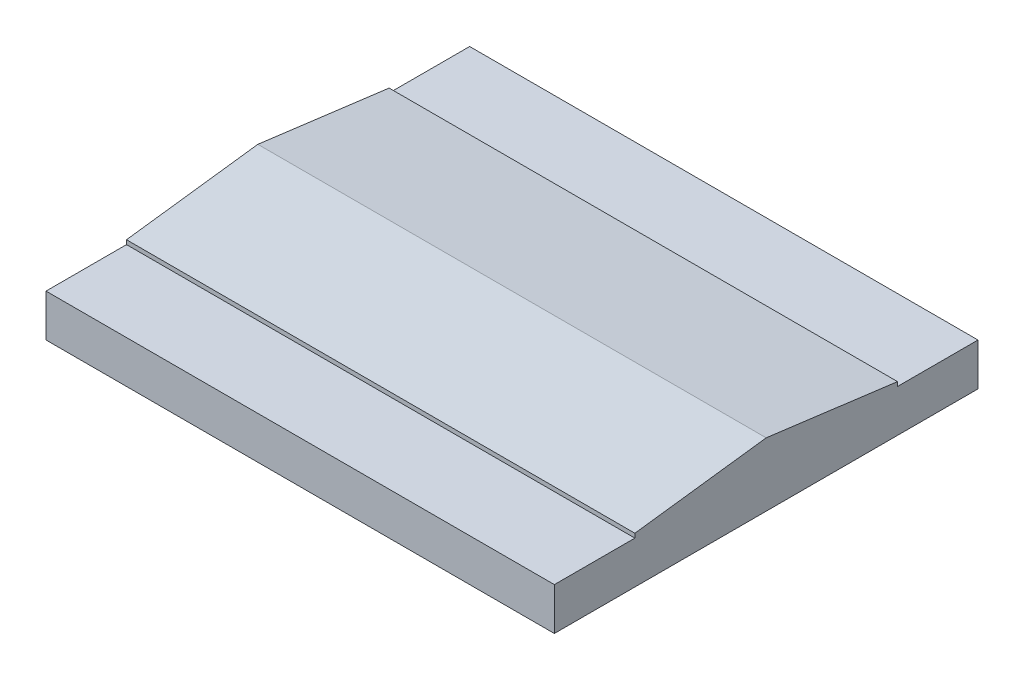
ISO-10303-21;
HEADER;
FILE_DESCRIPTION(('STEP AP214'),'2;1');
FILE_NAME('part.step','',(''),(''),'','','');
FILE_SCHEMA(('AUTOMOTIVE_DESIGN { 1 0 10303 214 1 1 1 1 }'));
ENDSEC;
DATA;
#1=APPLICATION_CONTEXT('core data for automotive mechanical design processes');
#2=APPLICATION_PROTOCOL_DEFINITION('international standard','automotive_design',2000,#1);
#3=PRODUCT_CONTEXT('',#1,'mechanical');
#4=PRODUCT('Part','Part','',(#3));
#5=PRODUCT_RELATED_PRODUCT_CATEGORY('part','',(#4));
#6=PRODUCT_DEFINITION_FORMATION('','',#4);
#7=PRODUCT_DEFINITION_CONTEXT('part definition',#1,'design');
#8=PRODUCT_DEFINITION('design','',#6,#7);
#9=PRODUCT_DEFINITION_SHAPE('','',#8);
#10=(LENGTH_UNIT() NAMED_UNIT(*) SI_UNIT(.MILLI.,.METRE.));
#11=(NAMED_UNIT(*) PLANE_ANGLE_UNIT() SI_UNIT($,.RADIAN.));
#12=(NAMED_UNIT(*) SI_UNIT($,.STERADIAN.) SOLID_ANGLE_UNIT());
#13=UNCERTAINTY_MEASURE_WITH_UNIT(LENGTH_MEASURE(1.E-05),#10,'distance_accuracy_value','');
#14=(GEOMETRIC_REPRESENTATION_CONTEXT(3) GLOBAL_UNCERTAINTY_ASSIGNED_CONTEXT((#13)) GLOBAL_UNIT_ASSIGNED_CONTEXT((#10,
#11,#12)) REPRESENTATION_CONTEXT('',''));
#15=CARTESIAN_POINT('',(0.,0.,0.));
#16=DIRECTION('',(0.,0.,1.));
#17=DIRECTION('',(1.,0.,0.));
#18=AXIS2_PLACEMENT_3D('',#15,#16,#17);
#19=CARTESIAN_POINT('',(-1.11022302462516E-13,75.,-500.));
#20=DIRECTION('',(1.,0.,0.));
#21=DIRECTION('',(0.,0.,-1.));
#22=AXIS2_PLACEMENT_3D('',#19,#20,#21);
#23=PLANE('',#22);
#24=DIRECTION('',(0.,1.,0.));
#25=VECTOR('',#24,1.);
#26=CARTESIAN_POINT('',(-2.22044604925031E-13,50.0000000000001,-94.9999999999999));
#27=LINE('',#26,#25);
#28=CARTESIAN_POINT('',(-2.22044604925031E-13,50.0000000000001,-94.9999999999999));
#29=VERTEX_POINT('',#28);
#30=CARTESIAN_POINT('',(-2.22044604925031E-13,55.0000000000001,-94.9999999999999));
#31=VERTEX_POINT('',#30);
#32=EDGE_CURVE('E125',#29,#31,#27,.T.);
#33=ORIENTED_EDGE('',*,*,#32,.T.);
#34=DIRECTION('',(0.,0.127971337630196,-0.991777866634025));
#35=VECTOR('',#34,1.);
#36=CARTESIAN_POINT('',(-2.22044604925031E-13,55.0000000000001,-94.9999999999999));
#37=LINE('',#36,#35);
#38=CARTESIAN_POINT('',(-2.22044604925031E-13,75.,-250.));
#39=VERTEX_POINT('',#38);
#40=EDGE_CURVE('E109',#31,#39,#37,.T.);
#41=ORIENTED_EDGE('',*,*,#40,.T.);
#42=DIRECTION('',(0.,-0.127971337630196,-0.991777866634025));
#43=VECTOR('',#42,1.);
#44=CARTESIAN_POINT('',(-1.11022302462516E-13,75.,-250.));
#45=LINE('',#44,#43);
#46=CARTESIAN_POINT('',(-2.22044604925031E-13,55.0000000000001,-405.));
#47=VERTEX_POINT('',#46);
#48=EDGE_CURVE('E122',#39,#47,#45,.T.);
#49=ORIENTED_EDGE('',*,*,#48,.T.);
#50=DIRECTION('',(0.,-1.,0.));
#51=VECTOR('',#50,1.);
#52=CARTESIAN_POINT('',(-2.22044604925031E-13,55.0000000000001,-405.));
#53=LINE('',#52,#51);
#54=CARTESIAN_POINT('',(-2.22044604925031E-13,50.0000000000001,-405.));
#55=VERTEX_POINT('',#54);
#56=EDGE_CURVE('E132',#47,#55,#53,.T.);
#57=ORIENTED_EDGE('',*,*,#56,.T.);
#58=DIRECTION('',(0.,0.,-1.));
#59=VECTOR('',#58,1.);
#60=CARTESIAN_POINT('',(-2.22044604925031E-13,50.0000000000001,-405.));
#61=LINE('',#60,#59);
#62=CARTESIAN_POINT('',(-2.22044604925031E-13,49.9999999999999,-500.));
#63=VERTEX_POINT('',#62);
#64=EDGE_CURVE('E135',#55,#63,#61,.T.);
#65=ORIENTED_EDGE('',*,*,#64,.T.);
#66=DIRECTION('',(0.,-1.,0.));
#67=VECTOR('',#66,1.);
#68=CARTESIAN_POINT('',(-1.11022302462516E-13,75.,-500.));
#69=LINE('',#68,#67);
#70=CARTESIAN_POINT('',(-1.11022302462516E-13,0.,-500.));
#71=VERTEX_POINT('',#70);
#72=EDGE_CURVE('E48',#63,#71,#69,.T.);
#73=ORIENTED_EDGE('',*,*,#72,.T.);
#74=DIRECTION('',(0.,0.,1.));
#75=VECTOR('',#74,1.);
#76=CARTESIAN_POINT('',(-1.11022302462516E-13,0.,-500.));
#77=LINE('',#76,#75);
#78=CARTESIAN_POINT('',(0.,0.,0.));
#79=VERTEX_POINT('',#78);
#80=EDGE_CURVE('E117',#71,#79,#77,.T.);
#81=ORIENTED_EDGE('',*,*,#80,.T.);
#82=DIRECTION('',(0.,-1.,0.));
#83=VECTOR('',#82,1.);
#84=CARTESIAN_POINT('',(0.,75.,0.));
#85=LINE('',#84,#83);
#86=CARTESIAN_POINT('',(-2.22044604925031E-13,50.0000000000001,1.33226762955019E-13));
#87=VERTEX_POINT('',#86);
#88=EDGE_CURVE('E11',#87,#79,#85,.T.);
#89=ORIENTED_EDGE('',*,*,#88,.F.);
#90=DIRECTION('',(0.,0.,-1.));
#91=VECTOR('',#90,1.);
#92=CARTESIAN_POINT('',(-2.22044604925031E-13,50.0000000000001,1.33226762955019E-13));
#93=LINE('',#92,#91);
#94=EDGE_CURVE('E126',#87,#29,#93,.T.);
#95=ORIENTED_EDGE('',*,*,#94,.T.);
#96=EDGE_LOOP('',(#33,#41,#49,#57,#65,#73,#81,#89,#95));
#97=FACE_BOUND('',#96,.T.);
#98=ADVANCED_FACE('F34',(#97),#23,.F.);
#99=CARTESIAN_POINT('',(0.,75.,0.));
#100=DIRECTION('',(0.,0.,-1.));
#101=DIRECTION('',(-1.,0.,0.));
#102=AXIS2_PLACEMENT_3D('',#99,#100,#101);
#103=PLANE('',#102);
#104=DIRECTION('',(0.,-1.,0.));
#105=VECTOR('',#104,1.);
#106=CARTESIAN_POINT('',(600.,75.,0.));
#107=LINE('',#106,#105);
#108=CARTESIAN_POINT('',(600.,50.0000000000001,0.));
#109=VERTEX_POINT('',#108);
#110=CARTESIAN_POINT('',(600.,0.,0.));
#111=VERTEX_POINT('',#110);
#112=EDGE_CURVE('E41',#109,#111,#107,.T.);
#113=ORIENTED_EDGE('',*,*,#112,.F.);
#114=DIRECTION('',(1.,0.,0.));
#115=VECTOR('',#114,1.);
#116=CARTESIAN_POINT('',(-2.22044604925031E-13,50.0000000000001,1.33226762955019E-13));
#117=LINE('',#116,#115);
#118=EDGE_CURVE('E140',#87,#109,#117,.T.);
#119=ORIENTED_EDGE('',*,*,#118,.F.);
#120=ORIENTED_EDGE('',*,*,#88,.T.);
#121=DIRECTION('',(1.,0.,0.));
#122=VECTOR('',#121,1.);
#123=CARTESIAN_POINT('',(0.,0.,0.));
#124=LINE('',#123,#122);
#125=EDGE_CURVE('E154',#79,#111,#124,.T.);
#126=ORIENTED_EDGE('',*,*,#125,.T.);
#127=EDGE_LOOP('',(#113,#119,#120,#126));
#128=FACE_BOUND('',#127,.T.);
#129=ADVANCED_FACE('F174',(#128),#103,.F.);
#130=CARTESIAN_POINT('',(600.,75.,-500.));
#131=DIRECTION('',(-1.,0.,0.));
#132=DIRECTION('',(0.,0.,1.));
#133=AXIS2_PLACEMENT_3D('',#130,#131,#132);
#134=PLANE('',#133);
#135=DIRECTION('',(0.,-0.127971337630196,-0.991777866634025));
#136=VECTOR('',#135,1.);
#137=CARTESIAN_POINT('',(600.,75.,-250.));
#138=LINE('',#137,#136);
#139=CARTESIAN_POINT('',(600.,75.,-250.));
#140=VERTEX_POINT('',#139);
#141=CARTESIAN_POINT('',(600.,55.0000000000001,-405.));
#142=VERTEX_POINT('',#141);
#143=EDGE_CURVE('E144',#140,#142,#138,.T.);
#144=ORIENTED_EDGE('',*,*,#143,.F.);
#145=DIRECTION('',(0.,0.127971337630196,-0.991777866634025));
#146=VECTOR('',#145,1.);
#147=CARTESIAN_POINT('',(600.,55.0000000000001,-95.));
#148=LINE('',#147,#146);
#149=CARTESIAN_POINT('',(600.,55.0000000000001,-95.));
#150=VERTEX_POINT('',#149);
#151=EDGE_CURVE('E112',#150,#140,#148,.T.);
#152=ORIENTED_EDGE('',*,*,#151,.F.);
#153=DIRECTION('',(0.,1.,0.));
#154=VECTOR('',#153,1.);
#155=CARTESIAN_POINT('',(600.,50.0000000000001,-95.));
#156=LINE('',#155,#154);
#157=CARTESIAN_POINT('',(600.,50.0000000000001,-95.));
#158=VERTEX_POINT('',#157);
#159=EDGE_CURVE('E127',#158,#150,#156,.T.);
#160=ORIENTED_EDGE('',*,*,#159,.F.);
#161=DIRECTION('',(0.,0.,-1.));
#162=VECTOR('',#161,1.);
#163=CARTESIAN_POINT('',(600.,50.0000000000001,0.));
#164=LINE('',#163,#162);
#165=EDGE_CURVE('E170',#109,#158,#164,.T.);
#166=ORIENTED_EDGE('',*,*,#165,.F.);
#167=ORIENTED_EDGE('',*,*,#112,.T.);
#168=DIRECTION('',(0.,0.,-1.));
#169=VECTOR('',#168,1.);
#170=CARTESIAN_POINT('',(600.,0.,-500.));
#171=LINE('',#170,#169);
#172=CARTESIAN_POINT('',(600.,0.,-500.));
#173=VERTEX_POINT('',#172);
#174=EDGE_CURVE('E157',#111,#173,#171,.T.);
#175=ORIENTED_EDGE('',*,*,#174,.T.);
#176=DIRECTION('',(0.,-1.,0.));
#177=VECTOR('',#176,1.);
#178=CARTESIAN_POINT('',(600.,75.,-500.));
#179=LINE('',#178,#177);
#180=CARTESIAN_POINT('',(600.,49.9999999999999,-500.));
#181=VERTEX_POINT('',#180);
#182=EDGE_CURVE('E55',#181,#173,#179,.T.);
#183=ORIENTED_EDGE('',*,*,#182,.F.);
#184=DIRECTION('',(0.,0.,-1.));
#185=VECTOR('',#184,1.);
#186=CARTESIAN_POINT('',(600.,50.0000000000001,-405.));
#187=LINE('',#186,#185);
#188=CARTESIAN_POINT('',(600.,50.0000000000001,-405.));
#189=VERTEX_POINT('',#188);
#190=EDGE_CURVE('E133',#189,#181,#187,.T.);
#191=ORIENTED_EDGE('',*,*,#190,.F.);
#192=DIRECTION('',(0.,-1.,0.));
#193=VECTOR('',#192,1.);
#194=CARTESIAN_POINT('',(600.,55.0000000000001,-405.));
#195=LINE('',#194,#193);
#196=EDGE_CURVE('E137',#142,#189,#195,.T.);
#197=ORIENTED_EDGE('',*,*,#196,.F.);
#198=EDGE_LOOP('',(#144,#152,#160,#166,#167,#175,#183,#191,#197));
#199=FACE_BOUND('',#198,.T.);
#200=ADVANCED_FACE('F165',(#199),#134,.F.);
#201=CARTESIAN_POINT('',(-1.11022302462516E-13,75.,-500.));
#202=DIRECTION('',(0.,0.,1.));
#203=DIRECTION('',(1.,0.,0.));
#204=AXIS2_PLACEMENT_3D('',#201,#202,#203);
#205=PLANE('',#204);
#206=ORIENTED_EDGE('',*,*,#72,.F.);
#207=DIRECTION('',(1.,0.,0.));
#208=VECTOR('',#207,1.);
#209=CARTESIAN_POINT('',(-2.22044604925031E-13,49.9999999999999,-500.));
#210=LINE('',#209,#208);
#211=EDGE_CURVE('E118',#63,#181,#210,.T.);
#212=ORIENTED_EDGE('',*,*,#211,.T.);
#213=ORIENTED_EDGE('',*,*,#182,.T.);
#214=DIRECTION('',(-1.,0.,0.));
#215=VECTOR('',#214,1.);
#216=CARTESIAN_POINT('',(-1.11022302462516E-13,0.,-500.));
#217=LINE('',#216,#215);
#218=EDGE_CURVE('E159',#173,#71,#217,.T.);
#219=ORIENTED_EDGE('',*,*,#218,.T.);
#220=EDGE_LOOP('',(#206,#212,#213,#219));
#221=FACE_BOUND('',#220,.T.);
#222=ADVANCED_FACE('F179',(#221),#205,.F.);
#223=CARTESIAN_POINT('',(0.,0.,0.));
#224=DIRECTION('',(0.,1.,0.));
#225=DIRECTION('',(0.,0.,1.));
#226=AXIS2_PLACEMENT_3D('',#223,#224,#225);
#227=PLANE('',#226);
#228=ORIENTED_EDGE('',*,*,#80,.F.);
#229=ORIENTED_EDGE('',*,*,#218,.F.);
#230=ORIENTED_EDGE('',*,*,#174,.F.);
#231=ORIENTED_EDGE('',*,*,#125,.F.);
#232=EDGE_LOOP('',(#228,#229,#230,#231));
#233=FACE_BOUND('',#232,.T.);
#234=ADVANCED_FACE('F178',(#233),#227,.F.);
#235=CARTESIAN_POINT('',(-1.11022302462516E-13,75.,-250.));
#236=DIRECTION('',(0.,-0.991777866634025,0.127971337630196));
#237=DIRECTION('',(0.,-0.127971337630196,-0.991777866634025));
#238=AXIS2_PLACEMENT_3D('',#235,#236,#237);
#239=PLANE('',#238);
#240=ORIENTED_EDGE('',*,*,#143,.T.);
#241=DIRECTION('',(1.,0.,0.));
#242=VECTOR('',#241,1.);
#243=CARTESIAN_POINT('',(-2.22044604925031E-13,55.0000000000001,-405.));
#244=LINE('',#243,#242);
#245=EDGE_CURVE('E130',#47,#142,#244,.T.);
#246=ORIENTED_EDGE('',*,*,#245,.F.);
#247=ORIENTED_EDGE('',*,*,#48,.F.);
#248=DIRECTION('',(1.,0.,0.));
#249=VECTOR('',#248,1.);
#250=CARTESIAN_POINT('',(-1.11022302462516E-13,75.,-250.));
#251=LINE('',#250,#249);
#252=EDGE_CURVE('E106',#39,#140,#251,.T.);
#253=ORIENTED_EDGE('',*,*,#252,.T.);
#254=EDGE_LOOP('',(#240,#246,#247,#253));
#255=FACE_BOUND('',#254,.T.);
#256=ADVANCED_FACE('F129',(#255),#239,.F.);
#257=CARTESIAN_POINT('',(-2.22044604925031E-13,50.0000000000001,-405.));
#258=DIRECTION('',(0.,-1.,0.));
#259=DIRECTION('',(0.,0.,-1.));
#260=AXIS2_PLACEMENT_3D('',#257,#258,#259);
#261=PLANE('',#260);
#262=ORIENTED_EDGE('',*,*,#190,.T.);
#263=ORIENTED_EDGE('',*,*,#211,.F.);
#264=ORIENTED_EDGE('',*,*,#64,.F.);
#265=DIRECTION('',(1.,0.,0.));
#266=VECTOR('',#265,1.);
#267=CARTESIAN_POINT('',(-2.22044604925031E-13,50.0000000000001,-405.));
#268=LINE('',#267,#266);
#269=EDGE_CURVE('E150',#55,#189,#268,.T.);
#270=ORIENTED_EDGE('',*,*,#269,.T.);
#271=EDGE_LOOP('',(#262,#263,#264,#270));
#272=FACE_BOUND('',#271,.T.);
#273=ADVANCED_FACE('F184',(#272),#261,.F.);
#274=CARTESIAN_POINT('',(-2.22044604925031E-13,55.0000000000001,-405.));
#275=DIRECTION('',(0.,0.,1.));
#276=DIRECTION('',(1.,0.,0.));
#277=AXIS2_PLACEMENT_3D('',#274,#275,#276);
#278=PLANE('',#277);
#279=ORIENTED_EDGE('',*,*,#196,.T.);
#280=ORIENTED_EDGE('',*,*,#269,.F.);
#281=ORIENTED_EDGE('',*,*,#56,.F.);
#282=ORIENTED_EDGE('',*,*,#245,.T.);
#283=EDGE_LOOP('',(#279,#280,#281,#282));
#284=FACE_BOUND('',#283,.T.);
#285=ADVANCED_FACE('F186',(#284),#278,.F.);
#286=CARTESIAN_POINT('',(-2.22044604925031E-13,55.0000000000001,-94.9999999999999));
#287=DIRECTION('',(0.,-0.991777866634025,-0.127971337630196));
#288=DIRECTION('',(0.,0.127971337630196,-0.991777866634025));
#289=AXIS2_PLACEMENT_3D('',#286,#287,#288);
#290=PLANE('',#289);
#291=ORIENTED_EDGE('',*,*,#151,.T.);
#292=ORIENTED_EDGE('',*,*,#252,.F.);
#293=ORIENTED_EDGE('',*,*,#40,.F.);
#294=DIRECTION('',(1.,0.,0.));
#295=VECTOR('',#294,1.);
#296=CARTESIAN_POINT('',(-2.22044604925031E-13,55.0000000000001,-94.9999999999999));
#297=LINE('',#296,#295);
#298=EDGE_CURVE('E146',#31,#150,#297,.T.);
#299=ORIENTED_EDGE('',*,*,#298,.T.);
#300=EDGE_LOOP('',(#291,#292,#293,#299));
#301=FACE_BOUND('',#300,.T.);
#302=ADVANCED_FACE('F108',(#301),#290,.F.);
#303=CARTESIAN_POINT('',(-2.22044604925031E-13,50.0000000000001,-94.9999999999999));
#304=DIRECTION('',(0.,0.,-1.));
#305=DIRECTION('',(-1.,0.,0.));
#306=AXIS2_PLACEMENT_3D('',#303,#304,#305);
#307=PLANE('',#306);
#308=ORIENTED_EDGE('',*,*,#159,.T.);
#309=ORIENTED_EDGE('',*,*,#298,.F.);
#310=ORIENTED_EDGE('',*,*,#32,.F.);
#311=DIRECTION('',(1.,0.,0.));
#312=VECTOR('',#311,1.);
#313=CARTESIAN_POINT('',(-2.22044604925031E-13,50.0000000000001,-94.9999999999999));
#314=LINE('',#313,#312);
#315=EDGE_CURVE('E194',#29,#158,#314,.T.);
#316=ORIENTED_EDGE('',*,*,#315,.T.);
#317=EDGE_LOOP('',(#308,#309,#310,#316));
#318=FACE_BOUND('',#317,.T.);
#319=ADVANCED_FACE('F198',(#318),#307,.F.);
#320=CARTESIAN_POINT('',(-2.22044604925031E-13,50.0000000000001,1.33226762955019E-13));
#321=DIRECTION('',(0.,-1.,0.));
#322=DIRECTION('',(0.,0.,-1.));
#323=AXIS2_PLACEMENT_3D('',#320,#321,#322);
#324=PLANE('',#323);
#325=ORIENTED_EDGE('',*,*,#165,.T.);
#326=ORIENTED_EDGE('',*,*,#315,.F.);
#327=ORIENTED_EDGE('',*,*,#94,.F.);
#328=ORIENTED_EDGE('',*,*,#118,.T.);
#329=EDGE_LOOP('',(#325,#326,#327,#328));
#330=FACE_BOUND('',#329,.T.);
#331=ADVANCED_FACE('F197',(#330),#324,.F.);
#332=CLOSED_SHELL('',(#98,#129,#200,#222,#234,#256,#273,#285,#302,#319,#331));
#333=MANIFOLD_SOLID_BREP('B2',#332);
#334=ADVANCED_BREP_SHAPE_REPRESENTATION('',(#18,#333),#14);
#335=SHAPE_DEFINITION_REPRESENTATION(#9,#334);
ENDSEC;
END-ISO-10303-21;
